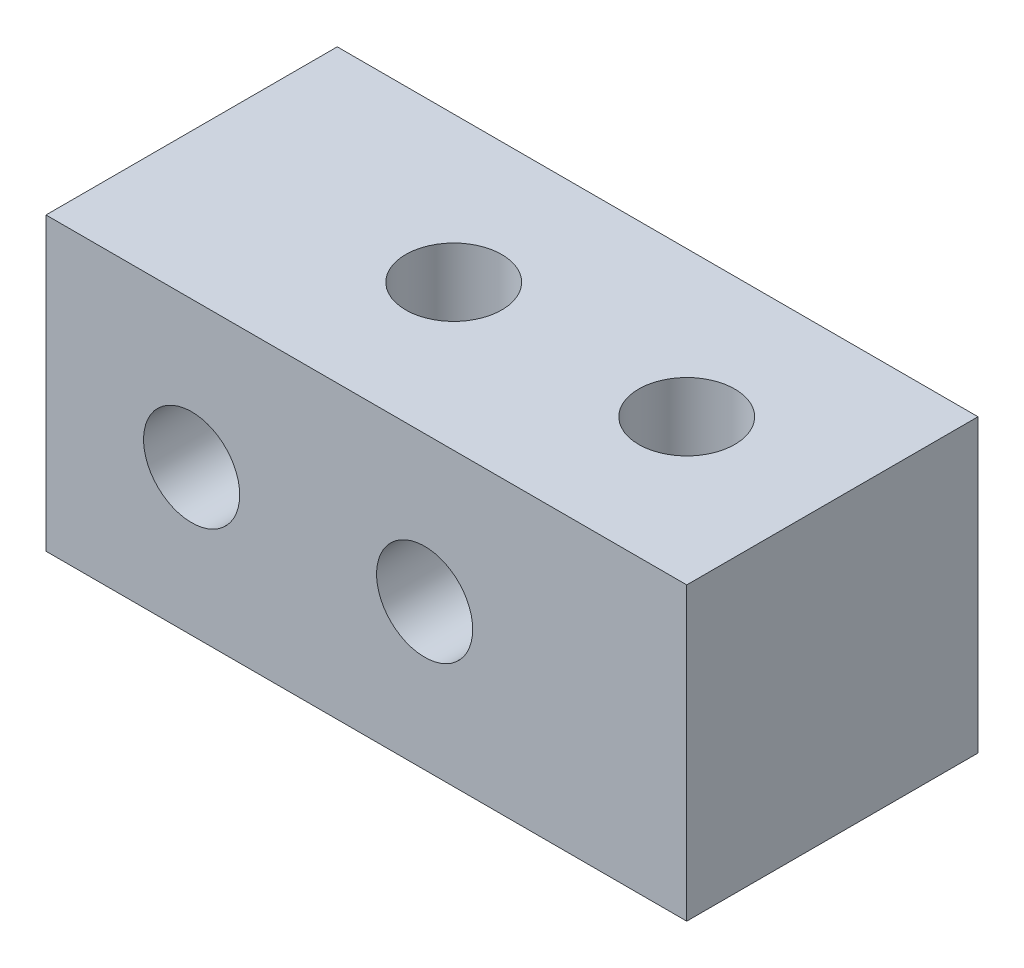
ISO-10303-21;
HEADER;
FILE_DESCRIPTION(('STEP AP214'),'2;1');
FILE_NAME('part.step','',(''),(''),'','','');
FILE_SCHEMA(('AUTOMOTIVE_DESIGN { 1 0 10303 214 1 1 1 1 }'));
ENDSEC;
DATA;
#1=APPLICATION_CONTEXT('core data for automotive mechanical design processes');
#2=APPLICATION_PROTOCOL_DEFINITION('international standard','automotive_design',2000,#1);
#3=PRODUCT_CONTEXT('',#1,'mechanical');
#4=PRODUCT('Part','Part','',(#3));
#5=PRODUCT_RELATED_PRODUCT_CATEGORY('part','',(#4));
#6=PRODUCT_DEFINITION_FORMATION('','',#4);
#7=PRODUCT_DEFINITION_CONTEXT('part definition',#1,'design');
#8=PRODUCT_DEFINITION('design','',#6,#7);
#9=PRODUCT_DEFINITION_SHAPE('','',#8);
#10=(LENGTH_UNIT() NAMED_UNIT(*) SI_UNIT(.MILLI.,.METRE.));
#11=(NAMED_UNIT(*) PLANE_ANGLE_UNIT() SI_UNIT($,.RADIAN.));
#12=(NAMED_UNIT(*) SI_UNIT($,.STERADIAN.) SOLID_ANGLE_UNIT());
#13=UNCERTAINTY_MEASURE_WITH_UNIT(LENGTH_MEASURE(1.E-05),#10,'distance_accuracy_value','');
#14=(GEOMETRIC_REPRESENTATION_CONTEXT(3) GLOBAL_UNCERTAINTY_ASSIGNED_CONTEXT((#13)) GLOBAL_UNIT_ASSIGNED_CONTEXT((#10,
#11,#12)) REPRESENTATION_CONTEXT('',''));
#15=CARTESIAN_POINT('',(0.,0.,0.));
#16=DIRECTION('',(0.,0.,1.));
#17=DIRECTION('',(1.,0.,0.));
#18=AXIS2_PLACEMENT_3D('',#15,#16,#17);
#19=CARTESIAN_POINT('',(-11.,-5.,10.));
#20=DIRECTION('',(1.,0.,0.));
#21=DIRECTION('',(0.,0.,-1.));
#22=AXIS2_PLACEMENT_3D('',#19,#20,#21);
#23=PLANE('',#22);
#24=DIRECTION('',(0.,-1.,0.));
#25=VECTOR('',#24,1.);
#26=CARTESIAN_POINT('',(-11.,-5.,0.));
#27=LINE('',#26,#25);
#28=CARTESIAN_POINT('',(-11.,5.,0.));
#29=VERTEX_POINT('',#28);
#30=CARTESIAN_POINT('',(-11.,-5.,0.));
#31=VERTEX_POINT('',#30);
#32=EDGE_CURVE('E109',#29,#31,#27,.T.);
#33=ORIENTED_EDGE('',*,*,#32,.T.);
#34=DIRECTION('',(0.,0.,-1.));
#35=VECTOR('',#34,1.);
#36=CARTESIAN_POINT('',(-11.,-5.,10.));
#37=LINE('',#36,#35);
#38=CARTESIAN_POINT('',(-11.,-5.,10.));
#39=VERTEX_POINT('',#38);
#40=EDGE_CURVE('E11',#39,#31,#37,.T.);
#41=ORIENTED_EDGE('',*,*,#40,.F.);
#42=DIRECTION('',(0.,-1.,0.));
#43=VECTOR('',#42,1.);
#44=CARTESIAN_POINT('',(-11.,-5.,10.));
#45=LINE('',#44,#43);
#46=CARTESIAN_POINT('',(-11.,5.,10.));
#47=VERTEX_POINT('',#46);
#48=EDGE_CURVE('E93',#47,#39,#45,.T.);
#49=ORIENTED_EDGE('',*,*,#48,.F.);
#50=DIRECTION('',(0.,0.,-1.));
#51=VECTOR('',#50,1.);
#52=CARTESIAN_POINT('',(-11.,5.,10.));
#53=LINE('',#52,#51);
#54=EDGE_CURVE('E105',#47,#29,#53,.T.);
#55=ORIENTED_EDGE('',*,*,#54,.T.);
#56=EDGE_LOOP('',(#33,#41,#49,#55));
#57=FACE_BOUND('',#56,.T.);
#58=ADVANCED_FACE('F41',(#57),#23,.F.);
#59=CARTESIAN_POINT('',(11.,-5.,10.));
#60=DIRECTION('',(0.,1.,0.));
#61=DIRECTION('',(-1.,0.,0.));
#62=AXIS2_PLACEMENT_3D('',#59,#60,#61);
#63=PLANE('',#62);
#64=CARTESIAN_POINT('',(-2.,-5.,5.));
#65=DIRECTION('',(0.,1.,0.));
#66=DIRECTION('',(0.,0.,1.));
#67=AXIS2_PLACEMENT_3D('',#64,#65,#66);
#68=CIRCLE('',#67,1.65);
#69=CARTESIAN_POINT('',(-2.,-5.,6.65));
#70=VERTEX_POINT('',#69);
#71=EDGE_CURVE('E137',#70,#70,#68,.T.);
#72=ORIENTED_EDGE('',*,*,#71,.T.);
#73=EDGE_LOOP('',(#72));
#74=FACE_BOUND('',#73,.T.);
#75=CARTESIAN_POINT('',(6.,-5.,5.));
#76=DIRECTION('',(0.,1.,0.));
#77=DIRECTION('',(0.,0.,1.));
#78=AXIS2_PLACEMENT_3D('',#75,#76,#77);
#79=CIRCLE('',#78,1.65);
#80=CARTESIAN_POINT('',(6.,-5.,6.65));
#81=VERTEX_POINT('',#80);
#82=EDGE_CURVE('E113',#81,#81,#79,.T.);
#83=ORIENTED_EDGE('',*,*,#82,.T.);
#84=EDGE_LOOP('',(#83));
#85=FACE_BOUND('',#84,.T.);
#86=DIRECTION('',(1.,0.,0.));
#87=VECTOR('',#86,1.);
#88=CARTESIAN_POINT('',(11.,-5.,0.));
#89=LINE('',#88,#87);
#90=CARTESIAN_POINT('',(11.,-5.,0.));
#91=VERTEX_POINT('',#90);
#92=EDGE_CURVE('E98',#31,#91,#89,.T.);
#93=ORIENTED_EDGE('',*,*,#92,.T.);
#94=DIRECTION('',(0.,0.,-1.));
#95=VECTOR('',#94,1.);
#96=CARTESIAN_POINT('',(11.,-5.,10.));
#97=LINE('',#96,#95);
#98=CARTESIAN_POINT('',(11.,-5.,10.));
#99=VERTEX_POINT('',#98);
#100=EDGE_CURVE('E50',#99,#91,#97,.T.);
#101=ORIENTED_EDGE('',*,*,#100,.F.);
#102=DIRECTION('',(1.,0.,0.));
#103=VECTOR('',#102,1.);
#104=CARTESIAN_POINT('',(11.,-5.,10.));
#105=LINE('',#104,#103);
#106=EDGE_CURVE('E88',#39,#99,#105,.T.);
#107=ORIENTED_EDGE('',*,*,#106,.F.);
#108=ORIENTED_EDGE('',*,*,#40,.T.);
#109=EDGE_LOOP('',(#93,#101,#107,#108));
#110=FACE_BOUND('',#109,.T.);
#111=ADVANCED_FACE('F97',(#74,#85,#110),#63,.F.);
#112=CARTESIAN_POINT('',(11.,-5.,10.));
#113=DIRECTION('',(-1.,0.,0.));
#114=DIRECTION('',(0.,0.,1.));
#115=AXIS2_PLACEMENT_3D('',#112,#113,#114);
#116=PLANE('',#115);
#117=DIRECTION('',(0.,1.,0.));
#118=VECTOR('',#117,1.);
#119=CARTESIAN_POINT('',(11.,-5.,0.));
#120=LINE('',#119,#118);
#121=CARTESIAN_POINT('',(11.,5.,0.));
#122=VERTEX_POINT('',#121);
#123=EDGE_CURVE('E75',#91,#122,#120,.T.);
#124=ORIENTED_EDGE('',*,*,#123,.T.);
#125=DIRECTION('',(0.,0.,-1.));
#126=VECTOR('',#125,1.);
#127=CARTESIAN_POINT('',(11.,5.,10.));
#128=LINE('',#127,#126);
#129=CARTESIAN_POINT('',(11.,5.,10.));
#130=VERTEX_POINT('',#129);
#131=EDGE_CURVE('E100',#130,#122,#128,.T.);
#132=ORIENTED_EDGE('',*,*,#131,.F.);
#133=DIRECTION('',(0.,1.,0.));
#134=VECTOR('',#133,1.);
#135=CARTESIAN_POINT('',(11.,-5.,10.));
#136=LINE('',#135,#134);
#137=EDGE_CURVE('E91',#99,#130,#136,.T.);
#138=ORIENTED_EDGE('',*,*,#137,.F.);
#139=ORIENTED_EDGE('',*,*,#100,.T.);
#140=EDGE_LOOP('',(#124,#132,#138,#139));
#141=FACE_BOUND('',#140,.T.);
#142=ADVANCED_FACE('F101',(#141),#116,.F.);
#143=CARTESIAN_POINT('',(11.,5.,10.));
#144=DIRECTION('',(0.,-1.,0.));
#145=DIRECTION('',(1.,0.,0.));
#146=AXIS2_PLACEMENT_3D('',#143,#144,#145);
#147=PLANE('',#146);
#148=CARTESIAN_POINT('',(-2.,5.,5.));
#149=DIRECTION('',(0.,1.,0.));
#150=DIRECTION('',(0.,0.,1.));
#151=AXIS2_PLACEMENT_3D('',#148,#149,#150);
#152=CIRCLE('',#151,1.65);
#153=CARTESIAN_POINT('',(-2.,5.,6.65));
#154=VERTEX_POINT('',#153);
#155=EDGE_CURVE('E141',#154,#154,#152,.T.);
#156=ORIENTED_EDGE('',*,*,#155,.F.);
#157=EDGE_LOOP('',(#156));
#158=FACE_BOUND('',#157,.T.);
#159=CARTESIAN_POINT('',(6.,5.,5.));
#160=DIRECTION('',(0.,1.,0.));
#161=DIRECTION('',(0.,0.,1.));
#162=AXIS2_PLACEMENT_3D('',#159,#160,#161);
#163=CIRCLE('',#162,1.65);
#164=CARTESIAN_POINT('',(6.,5.,6.65));
#165=VERTEX_POINT('',#164);
#166=EDGE_CURVE('E133',#165,#165,#163,.T.);
#167=ORIENTED_EDGE('',*,*,#166,.F.);
#168=EDGE_LOOP('',(#167));
#169=FACE_BOUND('',#168,.T.);
#170=DIRECTION('',(-1.,0.,0.));
#171=VECTOR('',#170,1.);
#172=CARTESIAN_POINT('',(11.,5.,0.));
#173=LINE('',#172,#171);
#174=EDGE_CURVE('E81',#122,#29,#173,.T.);
#175=ORIENTED_EDGE('',*,*,#174,.T.);
#176=ORIENTED_EDGE('',*,*,#54,.F.);
#177=DIRECTION('',(-1.,0.,0.));
#178=VECTOR('',#177,1.);
#179=CARTESIAN_POINT('',(11.,5.,10.));
#180=LINE('',#179,#178);
#181=EDGE_CURVE('E58',#130,#47,#180,.T.);
#182=ORIENTED_EDGE('',*,*,#181,.F.);
#183=ORIENTED_EDGE('',*,*,#131,.T.);
#184=EDGE_LOOP('',(#175,#176,#182,#183));
#185=FACE_BOUND('',#184,.T.);
#186=ADVANCED_FACE('F123',(#158,#169,#185),#147,.F.);
#187=CARTESIAN_POINT('',(0.,0.,10.));
#188=DIRECTION('',(0.,0.,1.));
#189=DIRECTION('',(1.,0.,0.));
#190=AXIS2_PLACEMENT_3D('',#187,#188,#189);
#191=PLANE('',#190);
#192=CARTESIAN_POINT('',(-6.,0.,10.));
#193=DIRECTION('',(0.,0.,1.));
#194=DIRECTION('',(1.,0.,0.));
#195=AXIS2_PLACEMENT_3D('',#192,#193,#194);
#196=CIRCLE('',#195,1.65);
#197=CARTESIAN_POINT('',(-4.35,0.,10.));
#198=VERTEX_POINT('',#197);
#199=EDGE_CURVE('E157',#198,#198,#196,.T.);
#200=ORIENTED_EDGE('',*,*,#199,.F.);
#201=EDGE_LOOP('',(#200));
#202=FACE_BOUND('',#201,.T.);
#203=CARTESIAN_POINT('',(2.,0.,10.));
#204=DIRECTION('',(0.,0.,1.));
#205=DIRECTION('',(1.,0.,0.));
#206=AXIS2_PLACEMENT_3D('',#203,#204,#205);
#207=CIRCLE('',#206,1.65);
#208=CARTESIAN_POINT('',(3.65,0.,10.));
#209=VERTEX_POINT('',#208);
#210=EDGE_CURVE('E149',#209,#209,#207,.T.);
#211=ORIENTED_EDGE('',*,*,#210,.F.);
#212=EDGE_LOOP('',(#211));
#213=FACE_BOUND('',#212,.T.);
#214=ORIENTED_EDGE('',*,*,#48,.T.);
#215=ORIENTED_EDGE('',*,*,#106,.T.);
#216=ORIENTED_EDGE('',*,*,#137,.T.);
#217=ORIENTED_EDGE('',*,*,#181,.T.);
#218=EDGE_LOOP('',(#214,#215,#216,#217));
#219=FACE_BOUND('',#218,.T.);
#220=ADVANCED_FACE('F89',(#202,#213,#219),#191,.T.);
#221=CARTESIAN_POINT('',(0.,0.,0.));
#222=DIRECTION('',(0.,0.,1.));
#223=DIRECTION('',(1.,0.,0.));
#224=AXIS2_PLACEMENT_3D('',#221,#222,#223);
#225=PLANE('',#224);
#226=CARTESIAN_POINT('',(-6.,0.,0.));
#227=DIRECTION('',(0.,0.,1.));
#228=DIRECTION('',(1.,0.,0.));
#229=AXIS2_PLACEMENT_3D('',#226,#227,#228);
#230=CIRCLE('',#229,1.65);
#231=CARTESIAN_POINT('',(-4.35,0.,0.));
#232=VERTEX_POINT('',#231);
#233=EDGE_CURVE('E153',#232,#232,#230,.T.);
#234=ORIENTED_EDGE('',*,*,#233,.T.);
#235=EDGE_LOOP('',(#234));
#236=FACE_BOUND('',#235,.T.);
#237=CARTESIAN_POINT('',(2.,0.,0.));
#238=DIRECTION('',(0.,0.,1.));
#239=DIRECTION('',(1.,0.,0.));
#240=AXIS2_PLACEMENT_3D('',#237,#238,#239);
#241=CIRCLE('',#240,1.65);
#242=CARTESIAN_POINT('',(3.65,0.,0.));
#243=VERTEX_POINT('',#242);
#244=EDGE_CURVE('E145',#243,#243,#241,.T.);
#245=ORIENTED_EDGE('',*,*,#244,.T.);
#246=EDGE_LOOP('',(#245));
#247=FACE_BOUND('',#246,.T.);
#248=ORIENTED_EDGE('',*,*,#32,.F.);
#249=ORIENTED_EDGE('',*,*,#174,.F.);
#250=ORIENTED_EDGE('',*,*,#123,.F.);
#251=ORIENTED_EDGE('',*,*,#92,.F.);
#252=EDGE_LOOP('',(#248,#249,#250,#251));
#253=FACE_BOUND('',#252,.T.);
#254=ADVANCED_FACE('F126',(#236,#247,#253),#225,.F.);
#255=CARTESIAN_POINT('',(6.,5.,5.));
#256=DIRECTION('',(0.,1.,0.));
#257=DIRECTION('',(0.,0.,1.));
#258=AXIS2_PLACEMENT_3D('',#255,#256,#257);
#259=CYLINDRICAL_SURFACE('',#258,1.65);
#260=ORIENTED_EDGE('',*,*,#82,.F.);
#261=EDGE_LOOP('',(#260));
#262=FACE_BOUND('',#261,.T.);
#263=ORIENTED_EDGE('',*,*,#166,.T.);
#264=EDGE_LOOP('',(#263));
#265=FACE_BOUND('',#264,.T.);
#266=ADVANCED_FACE('F180',(#262,#265),#259,.F.);
#267=CARTESIAN_POINT('',(-2.,5.,5.));
#268=DIRECTION('',(0.,1.,0.));
#269=DIRECTION('',(0.,0.,1.));
#270=AXIS2_PLACEMENT_3D('',#267,#268,#269);
#271=CYLINDRICAL_SURFACE('',#270,1.65);
#272=ORIENTED_EDGE('',*,*,#71,.F.);
#273=EDGE_LOOP('',(#272));
#274=FACE_BOUND('',#273,.T.);
#275=ORIENTED_EDGE('',*,*,#155,.T.);
#276=EDGE_LOOP('',(#275));
#277=FACE_BOUND('',#276,.T.);
#278=ADVANCED_FACE('F171',(#274,#277),#271,.F.);
#279=CARTESIAN_POINT('',(2.,0.,10.));
#280=DIRECTION('',(0.,0.,1.));
#281=DIRECTION('',(1.,0.,0.));
#282=AXIS2_PLACEMENT_3D('',#279,#280,#281);
#283=CYLINDRICAL_SURFACE('',#282,1.65);
#284=ORIENTED_EDGE('',*,*,#244,.F.);
#285=EDGE_LOOP('',(#284));
#286=FACE_BOUND('',#285,.T.);
#287=ORIENTED_EDGE('',*,*,#210,.T.);
#288=EDGE_LOOP('',(#287));
#289=FACE_BOUND('',#288,.T.);
#290=ADVANCED_FACE('F169',(#286,#289),#283,.F.);
#291=CARTESIAN_POINT('',(-6.,0.,10.));
#292=DIRECTION('',(0.,0.,1.));
#293=DIRECTION('',(1.,0.,0.));
#294=AXIS2_PLACEMENT_3D('',#291,#292,#293);
#295=CYLINDRICAL_SURFACE('',#294,1.65);
#296=ORIENTED_EDGE('',*,*,#233,.F.);
#297=EDGE_LOOP('',(#296));
#298=FACE_BOUND('',#297,.T.);
#299=ORIENTED_EDGE('',*,*,#199,.T.);
#300=EDGE_LOOP('',(#299));
#301=FACE_BOUND('',#300,.T.);
#302=ADVANCED_FACE('F162',(#298,#301),#295,.F.);
#303=CLOSED_SHELL('',(#58,#111,#142,#186,#220,#254,#266,#278,#290,#302));
#304=MANIFOLD_SOLID_BREP('B2',#303);
#305=ADVANCED_BREP_SHAPE_REPRESENTATION('',(#18,#304),#14);
#306=SHAPE_DEFINITION_REPRESENTATION(#9,#305);
ENDSEC;
END-ISO-10303-21;
